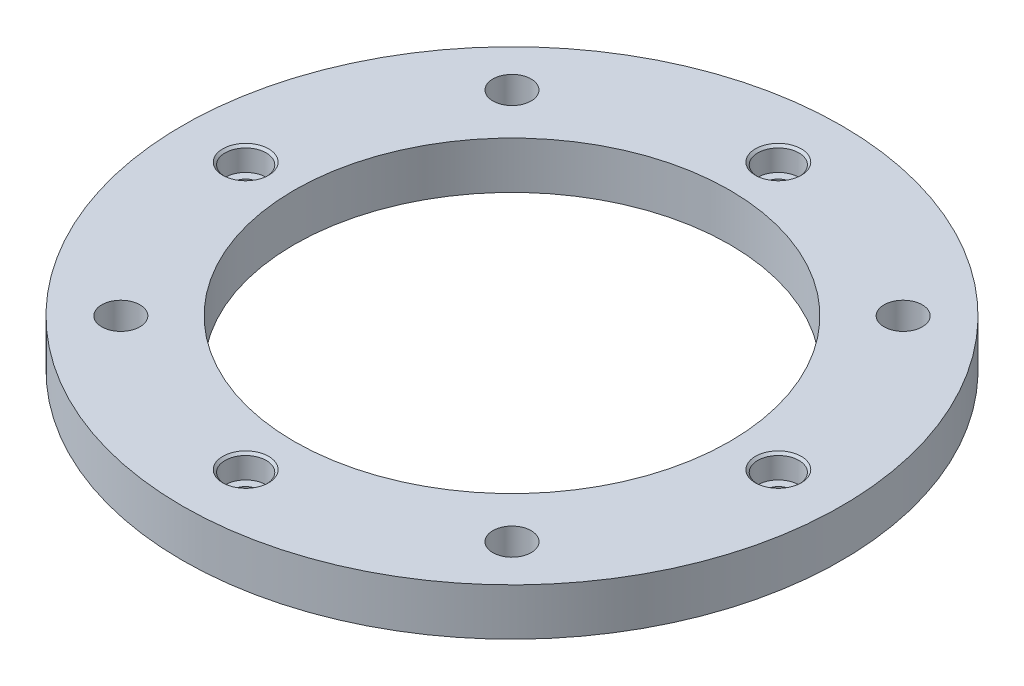
ISO-10303-21;
HEADER;
FILE_DESCRIPTION(('STEP AP214'),'2;1');
FILE_NAME('part.step','',(''),(''),'','','');
FILE_SCHEMA(('AUTOMOTIVE_DESIGN { 1 0 10303 214 1 1 1 1 }'));
ENDSEC;
DATA;
#1=APPLICATION_CONTEXT('core data for automotive mechanical design processes');
#2=APPLICATION_PROTOCOL_DEFINITION('international standard','automotive_design',2000,#1);
#3=PRODUCT_CONTEXT('',#1,'mechanical');
#4=PRODUCT('Part','Part','',(#3));
#5=PRODUCT_RELATED_PRODUCT_CATEGORY('part','',(#4));
#6=PRODUCT_DEFINITION_FORMATION('','',#4);
#7=PRODUCT_DEFINITION_CONTEXT('part definition',#1,'design');
#8=PRODUCT_DEFINITION('design','',#6,#7);
#9=PRODUCT_DEFINITION_SHAPE('','',#8);
#10=(LENGTH_UNIT() NAMED_UNIT(*) SI_UNIT(.MILLI.,.METRE.));
#11=(NAMED_UNIT(*) PLANE_ANGLE_UNIT() SI_UNIT($,.RADIAN.));
#12=(NAMED_UNIT(*) SI_UNIT($,.STERADIAN.) SOLID_ANGLE_UNIT());
#13=UNCERTAINTY_MEASURE_WITH_UNIT(LENGTH_MEASURE(1.E-05),#10,'distance_accuracy_value','');
#14=(GEOMETRIC_REPRESENTATION_CONTEXT(3) GLOBAL_UNCERTAINTY_ASSIGNED_CONTEXT((#13)) GLOBAL_UNIT_ASSIGNED_CONTEXT((#10,
#11,#12)) REPRESENTATION_CONTEXT('',''));
#15=CARTESIAN_POINT('',(0.,0.,0.));
#16=DIRECTION('',(0.,0.,1.));
#17=DIRECTION('',(1.,0.,0.));
#18=AXIS2_PLACEMENT_3D('',#15,#16,#17);
#19=CARTESIAN_POINT('',(0.,12.7,0.));
#20=DIRECTION('',(0.,-1.,0.));
#21=DIRECTION('',(0.,0.,-0.999999999999999));
#22=AXIS2_PLACEMENT_3D('',#19,#20,#21);
#23=PLANE('',#22);
#24=CARTESIAN_POINT('',(0.,12.7,-71.8420489685532));
#25=DIRECTION('',(0.,1.,0.));
#26=DIRECTION('',(0.,0.,0.999999999999999));
#27=AXIS2_PLACEMENT_3D('',#24,#25,#26);
#28=CIRCLE('',#27,6.19125);
#29=CARTESIAN_POINT('',(0.,12.7,-65.6507989685532));
#30=VERTEX_POINT('',#29);
#31=EDGE_CURVE('E152',#30,#30,#28,.T.);
#32=ORIENTED_EDGE('',*,*,#31,.F.);
#33=EDGE_LOOP('',(#32));
#34=FACE_BOUND('',#33,.T.);
#35=CARTESIAN_POINT('',(71.8420489685532,12.7,0.));
#36=DIRECTION('',(0.,1.,0.));
#37=DIRECTION('',(0.,0.,0.999999999999999));
#38=AXIS2_PLACEMENT_3D('',#35,#36,#37);
#39=CIRCLE('',#38,6.19125);
#40=CARTESIAN_POINT('',(71.8420489685532,12.7,6.19125000000007));
#41=VERTEX_POINT('',#40);
#42=EDGE_CURVE('E137',#41,#41,#39,.T.);
#43=ORIENTED_EDGE('',*,*,#42,.F.);
#44=EDGE_LOOP('',(#43));
#45=FACE_BOUND('',#44,.T.);
#46=CARTESIAN_POINT('',(-71.8420489685532,12.7,0.));
#47=DIRECTION('',(0.,1.,0.));
#48=DIRECTION('',(0.,0.,0.999999999999999));
#49=AXIS2_PLACEMENT_3D('',#46,#47,#48);
#50=CIRCLE('',#49,6.19125);
#51=CARTESIAN_POINT('',(-71.8420489685532,12.7,6.19125000000005));
#52=VERTEX_POINT('',#51);
#53=EDGE_CURVE('E122',#52,#52,#50,.T.);
#54=ORIENTED_EDGE('',*,*,#53,.F.);
#55=EDGE_LOOP('',(#54));
#56=FACE_BOUND('',#55,.T.);
#57=CARTESIAN_POINT('',(0.,12.7,71.8420489685532));
#58=DIRECTION('',(0.,1.,0.));
#59=DIRECTION('',(0.,0.,0.999999999999999));
#60=AXIS2_PLACEMENT_3D('',#57,#58,#59);
#61=CIRCLE('',#60,6.19125);
#62=CARTESIAN_POINT('',(0.,12.7,78.0332989685532));
#63=VERTEX_POINT('',#62);
#64=EDGE_CURVE('E107',#63,#63,#61,.T.);
#65=ORIENTED_EDGE('',*,*,#64,.F.);
#66=EDGE_LOOP('',(#65));
#67=FACE_BOUND('',#66,.T.);
#68=CARTESIAN_POINT('',(0.,12.7,0.));
#69=DIRECTION('',(0.,1.,0.));
#70=DIRECTION('',(0.,0.,0.999999999999999));
#71=AXIS2_PLACEMENT_3D('',#68,#69,#70);
#72=CIRCLE('',#71,58.7375);
#73=CARTESIAN_POINT('',(0.,12.7,58.7375));
#74=VERTEX_POINT('',#73);
#75=EDGE_CURVE('E87',#74,#74,#72,.T.);
#76=ORIENTED_EDGE('',*,*,#75,.F.);
#77=EDGE_LOOP('',(#76));
#78=FACE_BOUND('',#77,.T.);
#79=CARTESIAN_POINT('',(-52.7590047112812,12.7,-52.7590047112812));
#80=DIRECTION('',(0.,1.,0.));
#81=DIRECTION('',(0.,0.,0.999999999999999));
#82=AXIS2_PLACEMENT_3D('',#79,#80,#81);
#83=CIRCLE('',#82,5.15937499999999);
#84=CARTESIAN_POINT('',(-52.7590047112812,12.7,-47.5996297112812));
#85=VERTEX_POINT('',#84);
#86=EDGE_CURVE('E83',#85,#85,#83,.T.);
#87=ORIENTED_EDGE('',*,*,#86,.F.);
#88=EDGE_LOOP('',(#87));
#89=FACE_BOUND('',#88,.T.);
#90=CARTESIAN_POINT('',(52.7590047112813,12.7,-52.7590047112812));
#91=DIRECTION('',(0.,1.,0.));
#92=DIRECTION('',(0.,0.,0.999999999999999));
#93=AXIS2_PLACEMENT_3D('',#90,#91,#92);
#94=CIRCLE('',#93,5.15937499999999);
#95=CARTESIAN_POINT('',(52.7590047112813,12.7,-47.5996297112812));
#96=VERTEX_POINT('',#95);
#97=EDGE_CURVE('E75',#96,#96,#94,.T.);
#98=ORIENTED_EDGE('',*,*,#97,.F.);
#99=EDGE_LOOP('',(#98));
#100=FACE_BOUND('',#99,.T.);
#101=CARTESIAN_POINT('',(52.7590047112813,12.7,52.7590047112813));
#102=DIRECTION('',(0.,1.,0.));
#103=DIRECTION('',(0.,0.,0.999999999999999));
#104=AXIS2_PLACEMENT_3D('',#101,#102,#103);
#105=CIRCLE('',#104,5.15937499999999);
#106=CARTESIAN_POINT('',(52.7590047112813,12.7,57.9183797112813));
#107=VERTEX_POINT('',#106);
#108=EDGE_CURVE('E67',#107,#107,#105,.T.);
#109=ORIENTED_EDGE('',*,*,#108,.F.);
#110=EDGE_LOOP('',(#109));
#111=FACE_BOUND('',#110,.T.);
#112=CARTESIAN_POINT('',(-52.7590047112813,12.7,52.7590047112813));
#113=DIRECTION('',(0.,1.,0.));
#114=DIRECTION('',(0.,0.,0.999999999999999));
#115=AXIS2_PLACEMENT_3D('',#112,#113,#114);
#116=CIRCLE('',#115,5.15937499999999);
#117=CARTESIAN_POINT('',(-52.7590047112813,12.7,57.9183797112813));
#118=VERTEX_POINT('',#117);
#119=EDGE_CURVE('E58',#118,#118,#116,.T.);
#120=ORIENTED_EDGE('',*,*,#119,.F.);
#121=EDGE_LOOP('',(#120));
#122=FACE_BOUND('',#121,.T.);
#123=CARTESIAN_POINT('',(0.,12.7,0.));
#124=DIRECTION('',(0.,1.,0.));
#125=DIRECTION('',(0.,0.,0.999999999999999));
#126=AXIS2_PLACEMENT_3D('',#123,#124,#125);
#127=CIRCLE('',#126,88.9);
#128=CARTESIAN_POINT('',(0.,12.7,88.9));
#129=VERTEX_POINT('',#128);
#130=EDGE_CURVE('E90',#129,#129,#127,.T.);
#131=ORIENTED_EDGE('',*,*,#130,.T.);
#132=EDGE_LOOP('',(#131));
#133=FACE_BOUND('',#132,.T.);
#134=ADVANCED_FACE('F47',(#34,#45,#56,#67,#78,#89,#100,#111,#122,#133),#23,.F.);
#135=CARTESIAN_POINT('',(0.,0.,0.));
#136=DIRECTION('',(0.,-1.,0.));
#137=DIRECTION('',(0.,0.,-0.999999999999999));
#138=AXIS2_PLACEMENT_3D('',#135,#136,#137);
#139=PLANE('',#138);
#140=CARTESIAN_POINT('',(0.,0.,-71.8420489685532));
#141=DIRECTION('',(0.,1.,0.));
#142=DIRECTION('',(0.,0.,0.999999999999999));
#143=AXIS2_PLACEMENT_3D('',#140,#141,#142);
#144=CIRCLE('',#143,3.3782);
#145=CARTESIAN_POINT('',(0.,0.,-68.4638489685532));
#146=VERTEX_POINT('',#145);
#147=EDGE_CURVE('E140',#146,#146,#144,.T.);
#148=ORIENTED_EDGE('',*,*,#147,.T.);
#149=EDGE_LOOP('',(#148));
#150=FACE_BOUND('',#149,.T.);
#151=CARTESIAN_POINT('',(71.8420489685532,0.,0.));
#152=DIRECTION('',(0.,1.,0.));
#153=DIRECTION('',(0.,0.,0.999999999999999));
#154=AXIS2_PLACEMENT_3D('',#151,#152,#153);
#155=CIRCLE('',#154,3.3782);
#156=CARTESIAN_POINT('',(71.8420489685532,0.,3.37820000000008));
#157=VERTEX_POINT('',#156);
#158=EDGE_CURVE('E125',#157,#157,#155,.T.);
#159=ORIENTED_EDGE('',*,*,#158,.T.);
#160=EDGE_LOOP('',(#159));
#161=FACE_BOUND('',#160,.T.);
#162=CARTESIAN_POINT('',(-71.8420489685532,0.,0.));
#163=DIRECTION('',(0.,1.,0.));
#164=DIRECTION('',(0.,0.,0.999999999999999));
#165=AXIS2_PLACEMENT_3D('',#162,#163,#164);
#166=CIRCLE('',#165,3.3782);
#167=CARTESIAN_POINT('',(-71.8420489685532,0.,3.37820000000005));
#168=VERTEX_POINT('',#167);
#169=EDGE_CURVE('E110',#168,#168,#166,.T.);
#170=ORIENTED_EDGE('',*,*,#169,.T.);
#171=EDGE_LOOP('',(#170));
#172=FACE_BOUND('',#171,.T.);
#173=CARTESIAN_POINT('',(0.,0.,71.8420489685532));
#174=DIRECTION('',(0.,1.,0.));
#175=DIRECTION('',(0.,0.,0.999999999999999));
#176=AXIS2_PLACEMENT_3D('',#173,#174,#175);
#177=CIRCLE('',#176,3.3782);
#178=CARTESIAN_POINT('',(0.,0.,75.2202489685532));
#179=VERTEX_POINT('',#178);
#180=EDGE_CURVE('E95',#179,#179,#177,.T.);
#181=ORIENTED_EDGE('',*,*,#180,.T.);
#182=EDGE_LOOP('',(#181));
#183=FACE_BOUND('',#182,.T.);
#184=CARTESIAN_POINT('',(0.,0.,0.));
#185=DIRECTION('',(0.,1.,0.));
#186=DIRECTION('',(0.,0.,0.999999999999999));
#187=AXIS2_PLACEMENT_3D('',#184,#185,#186);
#188=CIRCLE('',#187,58.7375);
#189=CARTESIAN_POINT('',(0.,0.,58.7375));
#190=VERTEX_POINT('',#189);
#191=EDGE_CURVE('E86',#190,#190,#188,.T.);
#192=ORIENTED_EDGE('',*,*,#191,.T.);
#193=EDGE_LOOP('',(#192));
#194=FACE_BOUND('',#193,.T.);
#195=CARTESIAN_POINT('',(-52.7590047112812,0.,-52.7590047112812));
#196=DIRECTION('',(0.,-1.,0.));
#197=DIRECTION('',(0.,0.,-0.999999999999999));
#198=AXIS2_PLACEMENT_3D('',#195,#196,#197);
#199=CIRCLE('',#198,5.15937499999999);
#200=CARTESIAN_POINT('',(-52.7590047112812,0.,-57.9183797112812));
#201=VERTEX_POINT('',#200);
#202=EDGE_CURVE('E80',#201,#201,#199,.T.);
#203=ORIENTED_EDGE('',*,*,#202,.F.);
#204=EDGE_LOOP('',(#203));
#205=FACE_BOUND('',#204,.T.);
#206=CARTESIAN_POINT('',(52.7590047112813,0.,-52.7590047112812));
#207=DIRECTION('',(0.,-1.,0.));
#208=DIRECTION('',(0.,0.,-0.999999999999999));
#209=AXIS2_PLACEMENT_3D('',#206,#207,#208);
#210=CIRCLE('',#209,5.15937499999999);
#211=CARTESIAN_POINT('',(52.7590047112813,0.,-57.9183797112812));
#212=VERTEX_POINT('',#211);
#213=EDGE_CURVE('E71',#212,#212,#210,.T.);
#214=ORIENTED_EDGE('',*,*,#213,.F.);
#215=EDGE_LOOP('',(#214));
#216=FACE_BOUND('',#215,.T.);
#217=CARTESIAN_POINT('',(52.7590047112813,0.,52.7590047112813));
#218=DIRECTION('',(0.,-1.,0.));
#219=DIRECTION('',(0.,0.,-0.999999999999999));
#220=AXIS2_PLACEMENT_3D('',#217,#218,#219);
#221=CIRCLE('',#220,5.15937499999999);
#222=CARTESIAN_POINT('',(52.7590047112813,0.,47.5996297112813));
#223=VERTEX_POINT('',#222);
#224=EDGE_CURVE('E63',#223,#223,#221,.T.);
#225=ORIENTED_EDGE('',*,*,#224,.F.);
#226=EDGE_LOOP('',(#225));
#227=FACE_BOUND('',#226,.T.);
#228=CARTESIAN_POINT('',(-52.7590047112813,0.,52.7590047112813));
#229=DIRECTION('',(0.,-1.,0.));
#230=DIRECTION('',(0.,0.,-0.999999999999999));
#231=AXIS2_PLACEMENT_3D('',#228,#229,#230);
#232=CIRCLE('',#231,5.15937499999999);
#233=CARTESIAN_POINT('',(-52.7590047112813,0.,47.5996297112813));
#234=VERTEX_POINT('',#233);
#235=EDGE_CURVE('E54',#234,#234,#232,.T.);
#236=ORIENTED_EDGE('',*,*,#235,.F.);
#237=EDGE_LOOP('',(#236));
#238=FACE_BOUND('',#237,.T.);
#239=CARTESIAN_POINT('',(0.,0.,0.));
#240=DIRECTION('',(0.,-1.,0.));
#241=DIRECTION('',(0.,0.,-0.999999999999999));
#242=AXIS2_PLACEMENT_3D('',#239,#240,#241);
#243=CIRCLE('',#242,88.9);
#244=CARTESIAN_POINT('',(0.,0.,-88.9));
#245=VERTEX_POINT('',#244);
#246=EDGE_CURVE('E13',#245,#245,#243,.T.);
#247=ORIENTED_EDGE('',*,*,#246,.T.);
#248=EDGE_LOOP('',(#247));
#249=FACE_BOUND('',#248,.T.);
#250=ADVANCED_FACE('F49',(#150,#161,#172,#183,#194,#205,#216,#227,#238,#249),#139,.T.);
#251=CARTESIAN_POINT('',(-52.7590047112813,12.7,52.7590047112813));
#252=DIRECTION('',(0.,1.,0.));
#253=DIRECTION('',(0.,0.,0.999999999999999));
#254=AXIS2_PLACEMENT_3D('',#251,#252,#253);
#255=CYLINDRICAL_SURFACE('',#254,5.15937499999999);
#256=ORIENTED_EDGE('',*,*,#235,.T.);
#257=EDGE_LOOP('',(#256));
#258=FACE_BOUND('',#257,.T.);
#259=ORIENTED_EDGE('',*,*,#119,.T.);
#260=EDGE_LOOP('',(#259));
#261=FACE_BOUND('',#260,.T.);
#262=ADVANCED_FACE('F205',(#258,#261),#255,.F.);
#263=CARTESIAN_POINT('',(52.7590047112813,12.7,52.7590047112813));
#264=DIRECTION('',(0.,1.,0.));
#265=DIRECTION('',(0.,0.,0.999999999999999));
#266=AXIS2_PLACEMENT_3D('',#263,#264,#265);
#267=CYLINDRICAL_SURFACE('',#266,5.15937499999999);
#268=ORIENTED_EDGE('',*,*,#224,.T.);
#269=EDGE_LOOP('',(#268));
#270=FACE_BOUND('',#269,.T.);
#271=ORIENTED_EDGE('',*,*,#108,.T.);
#272=EDGE_LOOP('',(#271));
#273=FACE_BOUND('',#272,.T.);
#274=ADVANCED_FACE('F201',(#270,#273),#267,.F.);
#275=CARTESIAN_POINT('',(52.7590047112813,12.7,-52.7590047112812));
#276=DIRECTION('',(0.,1.,0.));
#277=DIRECTION('',(0.,0.,0.999999999999999));
#278=AXIS2_PLACEMENT_3D('',#275,#276,#277);
#279=CYLINDRICAL_SURFACE('',#278,5.15937499999999);
#280=ORIENTED_EDGE('',*,*,#213,.T.);
#281=EDGE_LOOP('',(#280));
#282=FACE_BOUND('',#281,.T.);
#283=ORIENTED_EDGE('',*,*,#97,.T.);
#284=EDGE_LOOP('',(#283));
#285=FACE_BOUND('',#284,.T.);
#286=ADVANCED_FACE('F197',(#282,#285),#279,.F.);
#287=CARTESIAN_POINT('',(-52.7590047112812,12.7,-52.7590047112812));
#288=DIRECTION('',(0.,1.,0.));
#289=DIRECTION('',(0.,0.,0.999999999999999));
#290=AXIS2_PLACEMENT_3D('',#287,#288,#289);
#291=CYLINDRICAL_SURFACE('',#290,5.15937499999999);
#292=ORIENTED_EDGE('',*,*,#202,.T.);
#293=EDGE_LOOP('',(#292));
#294=FACE_BOUND('',#293,.T.);
#295=ORIENTED_EDGE('',*,*,#86,.T.);
#296=EDGE_LOOP('',(#295));
#297=FACE_BOUND('',#296,.T.);
#298=ADVANCED_FACE('F190',(#294,#297),#291,.F.);
#299=CARTESIAN_POINT('',(0.,0.,0.));
#300=DIRECTION('',(0.,1.,0.));
#301=DIRECTION('',(0.,0.,0.999999999999999));
#302=AXIS2_PLACEMENT_3D('',#299,#300,#301);
#303=CYLINDRICAL_SURFACE('',#302,58.7375);
#304=ORIENTED_EDGE('',*,*,#191,.F.);
#305=EDGE_LOOP('',(#304));
#306=FACE_BOUND('',#305,.T.);
#307=ORIENTED_EDGE('',*,*,#75,.T.);
#308=EDGE_LOOP('',(#307));
#309=FACE_BOUND('',#308,.T.);
#310=ADVANCED_FACE('F181',(#306,#309),#303,.F.);
#311=CARTESIAN_POINT('',(0.,0.,0.));
#312=DIRECTION('',(0.,1.,0.));
#313=DIRECTION('',(0.,0.,0.999999999999999));
#314=AXIS2_PLACEMENT_3D('',#311,#312,#313);
#315=CYLINDRICAL_SURFACE('',#314,88.9);
#316=ORIENTED_EDGE('',*,*,#130,.F.);
#317=EDGE_LOOP('',(#316));
#318=FACE_BOUND('',#317,.T.);
#319=ORIENTED_EDGE('',*,*,#246,.F.);
#320=EDGE_LOOP('',(#319));
#321=FACE_BOUND('',#320,.T.);
#322=ADVANCED_FACE('F177',(#318,#321),#315,.T.);
#323=CARTESIAN_POINT('',(0.,12.7,71.8420489685532));
#324=DIRECTION('',(0.,1.,0.));
#325=DIRECTION('',(0.,0.,0.999999999999999));
#326=AXIS2_PLACEMENT_3D('',#323,#324,#325);
#327=CYLINDRICAL_SURFACE('',#326,3.3782);
#328=ORIENTED_EDGE('',*,*,#180,.F.);
#329=EDGE_LOOP('',(#328));
#330=FACE_BOUND('',#329,.T.);
#331=CARTESIAN_POINT('',(0.,6.35000000000001,71.8420489685532));
#332=DIRECTION('',(0.,1.,0.));
#333=DIRECTION('',(0.,0.,0.999999999999999));
#334=AXIS2_PLACEMENT_3D('',#331,#332,#333);
#335=CIRCLE('',#334,3.3782);
#336=CARTESIAN_POINT('',(0.,6.35000000000001,75.2202489685532));
#337=VERTEX_POINT('',#336);
#338=EDGE_CURVE('E98',#337,#337,#335,.T.);
#339=ORIENTED_EDGE('',*,*,#338,.T.);
#340=EDGE_LOOP('',(#339));
#341=FACE_BOUND('',#340,.T.);
#342=ADVANCED_FACE('F180',(#330,#341),#327,.F.);
#343=CARTESIAN_POINT('',(5.55625,6.35,71.8420489685532));
#344=DIRECTION('',(0.,-1.,0.));
#345=DIRECTION('',(0.,0.,-0.999999999999999));
#346=AXIS2_PLACEMENT_3D('',#343,#344,#345);
#347=PLANE('',#346);
#348=ORIENTED_EDGE('',*,*,#338,.F.);
#349=EDGE_LOOP('',(#348));
#350=FACE_BOUND('',#349,.T.);
#351=CARTESIAN_POINT('',(0.,6.35000000000001,71.8420489685532));
#352=DIRECTION('',(0.,1.,0.));
#353=DIRECTION('',(0.,0.,0.999999999999999));
#354=AXIS2_PLACEMENT_3D('',#351,#352,#353);
#355=CIRCLE('',#354,5.55625);
#356=CARTESIAN_POINT('',(0.,6.35000000000001,77.3982989685532));
#357=VERTEX_POINT('',#356);
#358=EDGE_CURVE('E101',#357,#357,#355,.T.);
#359=ORIENTED_EDGE('',*,*,#358,.T.);
#360=EDGE_LOOP('',(#359));
#361=FACE_BOUND('',#360,.T.);
#362=ADVANCED_FACE('F187',(#350,#361),#347,.F.);
#363=CARTESIAN_POINT('',(0.,12.7,71.8420489685532));
#364=DIRECTION('',(0.,1.,0.));
#365=DIRECTION('',(0.,0.,0.999999999999999));
#366=AXIS2_PLACEMENT_3D('',#363,#364,#365);
#367=CYLINDRICAL_SURFACE('',#366,5.55625);
#368=ORIENTED_EDGE('',*,*,#358,.F.);
#369=EDGE_LOOP('',(#368));
#370=FACE_BOUND('',#369,.T.);
#371=CARTESIAN_POINT('',(0.,12.065,71.8420489685532));
#372=DIRECTION('',(0.,1.,0.));
#373=DIRECTION('',(0.,0.,0.999999999999999));
#374=AXIS2_PLACEMENT_3D('',#371,#372,#373);
#375=CIRCLE('',#374,5.55625);
#376=CARTESIAN_POINT('',(0.,12.065,77.3982989685532));
#377=VERTEX_POINT('',#376);
#378=EDGE_CURVE('E104',#377,#377,#375,.T.);
#379=ORIENTED_EDGE('',*,*,#378,.T.);
#380=EDGE_LOOP('',(#379));
#381=FACE_BOUND('',#380,.T.);
#382=ADVANCED_FACE('F237',(#370,#381),#367,.F.);
#383=CARTESIAN_POINT('',(0.,12.7,71.8420489685532));
#384=DIRECTION('',(0.,1.,0.));
#385=DIRECTION('',(0.,0.,0.999999999999999));
#386=AXIS2_PLACEMENT_3D('',#383,#384,#385);
#387=CONICAL_SURFACE('',#386,6.19125,0.785398163397448);
#388=ORIENTED_EDGE('',*,*,#378,.F.);
#389=EDGE_LOOP('',(#388));
#390=FACE_BOUND('',#389,.T.);
#391=ORIENTED_EDGE('',*,*,#64,.T.);
#392=EDGE_LOOP('',(#391));
#393=FACE_BOUND('',#392,.T.);
#394=ADVANCED_FACE('F242',(#390,#393),#387,.F.);
#395=CARTESIAN_POINT('',(-71.8420489685532,12.7,0.));
#396=DIRECTION('',(0.,1.,0.));
#397=DIRECTION('',(0.,0.,0.999999999999999));
#398=AXIS2_PLACEMENT_3D('',#395,#396,#397);
#399=CYLINDRICAL_SURFACE('',#398,3.3782);
#400=ORIENTED_EDGE('',*,*,#169,.F.);
#401=EDGE_LOOP('',(#400));
#402=FACE_BOUND('',#401,.T.);
#403=CARTESIAN_POINT('',(-71.8420489685532,6.35000000000001,0.));
#404=DIRECTION('',(0.,1.,0.));
#405=DIRECTION('',(0.,0.,0.999999999999999));
#406=AXIS2_PLACEMENT_3D('',#403,#404,#405);
#407=CIRCLE('',#406,3.3782);
#408=CARTESIAN_POINT('',(-71.8420489685532,6.35000000000001,3.37820000000005));
#409=VERTEX_POINT('',#408);
#410=EDGE_CURVE('E113',#409,#409,#407,.T.);
#411=ORIENTED_EDGE('',*,*,#410,.T.);
#412=EDGE_LOOP('',(#411));
#413=FACE_BOUND('',#412,.T.);
#414=ADVANCED_FACE('F248',(#402,#413),#399,.F.);
#415=CARTESIAN_POINT('',(-66.2857989685532,6.35000000000001,0.));
#416=DIRECTION('',(0.,-1.,0.));
#417=DIRECTION('',(0.,0.,-0.999999999999999));
#418=AXIS2_PLACEMENT_3D('',#415,#416,#417);
#419=PLANE('',#418);
#420=ORIENTED_EDGE('',*,*,#410,.F.);
#421=EDGE_LOOP('',(#420));
#422=FACE_BOUND('',#421,.T.);
#423=CARTESIAN_POINT('',(-71.8420489685532,6.35000000000001,0.));
#424=DIRECTION('',(0.,1.,0.));
#425=DIRECTION('',(0.,0.,0.999999999999999));
#426=AXIS2_PLACEMENT_3D('',#423,#424,#425);
#427=CIRCLE('',#426,5.55625);
#428=CARTESIAN_POINT('',(-71.8420489685532,6.35000000000001,5.55625000000005));
#429=VERTEX_POINT('',#428);
#430=EDGE_CURVE('E116',#429,#429,#427,.T.);
#431=ORIENTED_EDGE('',*,*,#430,.T.);
#432=EDGE_LOOP('',(#431));
#433=FACE_BOUND('',#432,.T.);
#434=ADVANCED_FACE('F253',(#422,#433),#419,.F.);
#435=CARTESIAN_POINT('',(-71.8420489685532,12.7,0.));
#436=DIRECTION('',(0.,1.,0.));
#437=DIRECTION('',(0.,0.,0.999999999999999));
#438=AXIS2_PLACEMENT_3D('',#435,#436,#437);
#439=CYLINDRICAL_SURFACE('',#438,5.55625);
#440=ORIENTED_EDGE('',*,*,#430,.F.);
#441=EDGE_LOOP('',(#440));
#442=FACE_BOUND('',#441,.T.);
#443=CARTESIAN_POINT('',(-71.8420489685532,12.065,0.));
#444=DIRECTION('',(0.,1.,0.));
#445=DIRECTION('',(0.,0.,0.999999999999999));
#446=AXIS2_PLACEMENT_3D('',#443,#444,#445);
#447=CIRCLE('',#446,5.55625);
#448=CARTESIAN_POINT('',(-71.8420489685532,12.065,5.55625000000005));
#449=VERTEX_POINT('',#448);
#450=EDGE_CURVE('E119',#449,#449,#447,.T.);
#451=ORIENTED_EDGE('',*,*,#450,.T.);
#452=EDGE_LOOP('',(#451));
#453=FACE_BOUND('',#452,.T.);
#454=ADVANCED_FACE('F259',(#442,#453),#439,.F.);
#455=CARTESIAN_POINT('',(-71.8420489685532,12.7,0.));
#456=DIRECTION('',(0.,1.,0.));
#457=DIRECTION('',(0.,0.,0.999999999999999));
#458=AXIS2_PLACEMENT_3D('',#455,#456,#457);
#459=CONICAL_SURFACE('',#458,6.19125,0.785398163397446);
#460=ORIENTED_EDGE('',*,*,#450,.F.);
#461=EDGE_LOOP('',(#460));
#462=FACE_BOUND('',#461,.T.);
#463=ORIENTED_EDGE('',*,*,#53,.T.);
#464=EDGE_LOOP('',(#463));
#465=FACE_BOUND('',#464,.T.);
#466=ADVANCED_FACE('F263',(#462,#465),#459,.F.);
#467=CARTESIAN_POINT('',(71.8420489685532,12.7,0.));
#468=DIRECTION('',(0.,1.,0.));
#469=DIRECTION('',(0.,0.,0.999999999999999));
#470=AXIS2_PLACEMENT_3D('',#467,#468,#469);
#471=CYLINDRICAL_SURFACE('',#470,3.3782);
#472=ORIENTED_EDGE('',*,*,#158,.F.);
#473=EDGE_LOOP('',(#472));
#474=FACE_BOUND('',#473,.T.);
#475=CARTESIAN_POINT('',(71.8420489685532,6.35,0.));
#476=DIRECTION('',(0.,1.,0.));
#477=DIRECTION('',(0.,0.,0.999999999999999));
#478=AXIS2_PLACEMENT_3D('',#475,#476,#477);
#479=CIRCLE('',#478,3.3782);
#480=CARTESIAN_POINT('',(71.8420489685532,6.35,3.37820000000008));
#481=VERTEX_POINT('',#480);
#482=EDGE_CURVE('E128',#481,#481,#479,.T.);
#483=ORIENTED_EDGE('',*,*,#482,.T.);
#484=EDGE_LOOP('',(#483));
#485=FACE_BOUND('',#484,.T.);
#486=ADVANCED_FACE('F267',(#474,#485),#471,.F.);
#487=CARTESIAN_POINT('',(77.3982989685532,6.34999999999999,0.));
#488=DIRECTION('',(0.,-1.,0.));
#489=DIRECTION('',(0.,0.,-0.999999999999999));
#490=AXIS2_PLACEMENT_3D('',#487,#488,#489);
#491=PLANE('',#490);
#492=ORIENTED_EDGE('',*,*,#482,.F.);
#493=EDGE_LOOP('',(#492));
#494=FACE_BOUND('',#493,.T.);
#495=CARTESIAN_POINT('',(71.8420489685532,6.35,0.));
#496=DIRECTION('',(0.,1.,0.));
#497=DIRECTION('',(0.,0.,0.999999999999999));
#498=AXIS2_PLACEMENT_3D('',#495,#496,#497);
#499=CIRCLE('',#498,5.55625);
#500=CARTESIAN_POINT('',(71.8420489685532,6.35,5.55625000000008));
#501=VERTEX_POINT('',#500);
#502=EDGE_CURVE('E131',#501,#501,#499,.T.);
#503=ORIENTED_EDGE('',*,*,#502,.T.);
#504=EDGE_LOOP('',(#503));
#505=FACE_BOUND('',#504,.T.);
#506=ADVANCED_FACE('F271',(#494,#505),#491,.F.);
#507=CARTESIAN_POINT('',(71.8420489685532,12.7,0.));
#508=DIRECTION('',(0.,1.,0.));
#509=DIRECTION('',(0.,0.,0.999999999999999));
#510=AXIS2_PLACEMENT_3D('',#507,#508,#509);
#511=CYLINDRICAL_SURFACE('',#510,5.55625);
#512=ORIENTED_EDGE('',*,*,#502,.F.);
#513=EDGE_LOOP('',(#512));
#514=FACE_BOUND('',#513,.T.);
#515=CARTESIAN_POINT('',(71.8420489685532,12.065,0.));
#516=DIRECTION('',(0.,1.,0.));
#517=DIRECTION('',(0.,0.,0.999999999999999));
#518=AXIS2_PLACEMENT_3D('',#515,#516,#517);
#519=CIRCLE('',#518,5.55625);
#520=CARTESIAN_POINT('',(71.8420489685532,12.065,5.55625000000008));
#521=VERTEX_POINT('',#520);
#522=EDGE_CURVE('E134',#521,#521,#519,.T.);
#523=ORIENTED_EDGE('',*,*,#522,.T.);
#524=EDGE_LOOP('',(#523));
#525=FACE_BOUND('',#524,.T.);
#526=ADVANCED_FACE('F275',(#514,#525),#511,.F.);
#527=CARTESIAN_POINT('',(71.8420489685532,12.7,0.));
#528=DIRECTION('',(0.,1.,0.));
#529=DIRECTION('',(0.,0.,0.999999999999999));
#530=AXIS2_PLACEMENT_3D('',#527,#528,#529);
#531=CONICAL_SURFACE('',#530,6.19125,0.785398163397446);
#532=ORIENTED_EDGE('',*,*,#522,.F.);
#533=EDGE_LOOP('',(#532));
#534=FACE_BOUND('',#533,.T.);
#535=ORIENTED_EDGE('',*,*,#42,.T.);
#536=EDGE_LOOP('',(#535));
#537=FACE_BOUND('',#536,.T.);
#538=ADVANCED_FACE('F279',(#534,#537),#531,.F.);
#539=CARTESIAN_POINT('',(0.,12.7,-71.8420489685532));
#540=DIRECTION('',(0.,1.,0.));
#541=DIRECTION('',(0.,0.,0.999999999999999));
#542=AXIS2_PLACEMENT_3D('',#539,#540,#541);
#543=CYLINDRICAL_SURFACE('',#542,3.3782);
#544=ORIENTED_EDGE('',*,*,#147,.F.);
#545=EDGE_LOOP('',(#544));
#546=FACE_BOUND('',#545,.T.);
#547=CARTESIAN_POINT('',(0.,6.35,-71.8420489685532));
#548=DIRECTION('',(0.,1.,0.));
#549=DIRECTION('',(0.,0.,0.999999999999999));
#550=AXIS2_PLACEMENT_3D('',#547,#548,#549);
#551=CIRCLE('',#550,3.3782);
#552=CARTESIAN_POINT('',(0.,6.35,-68.4638489685532));
#553=VERTEX_POINT('',#552);
#554=EDGE_CURVE('E143',#553,#553,#551,.T.);
#555=ORIENTED_EDGE('',*,*,#554,.T.);
#556=EDGE_LOOP('',(#555));
#557=FACE_BOUND('',#556,.T.);
#558=ADVANCED_FACE('F283',(#546,#557),#543,.F.);
#559=CARTESIAN_POINT('',(5.55625,6.35,-71.8420489685532));
#560=DIRECTION('',(0.,-1.,0.));
#561=DIRECTION('',(0.,0.,-0.999999999999999));
#562=AXIS2_PLACEMENT_3D('',#559,#560,#561);
#563=PLANE('',#562);
#564=ORIENTED_EDGE('',*,*,#554,.F.);
#565=EDGE_LOOP('',(#564));
#566=FACE_BOUND('',#565,.T.);
#567=CARTESIAN_POINT('',(0.,6.35,-71.8420489685532));
#568=DIRECTION('',(0.,1.,0.));
#569=DIRECTION('',(0.,0.,0.999999999999999));
#570=AXIS2_PLACEMENT_3D('',#567,#568,#569);
#571=CIRCLE('',#570,5.55625);
#572=CARTESIAN_POINT('',(0.,6.35,-66.2857989685532));
#573=VERTEX_POINT('',#572);
#574=EDGE_CURVE('E146',#573,#573,#571,.T.);
#575=ORIENTED_EDGE('',*,*,#574,.T.);
#576=EDGE_LOOP('',(#575));
#577=FACE_BOUND('',#576,.T.);
#578=ADVANCED_FACE('F287',(#566,#577),#563,.F.);
#579=CARTESIAN_POINT('',(0.,12.7,-71.8420489685532));
#580=DIRECTION('',(0.,1.,0.));
#581=DIRECTION('',(0.,0.,0.999999999999999));
#582=AXIS2_PLACEMENT_3D('',#579,#580,#581);
#583=CYLINDRICAL_SURFACE('',#582,5.55625);
#584=ORIENTED_EDGE('',*,*,#574,.F.);
#585=EDGE_LOOP('',(#584));
#586=FACE_BOUND('',#585,.T.);
#587=CARTESIAN_POINT('',(0.,12.065,-71.8420489685532));
#588=DIRECTION('',(0.,1.,0.));
#589=DIRECTION('',(0.,0.,0.999999999999999));
#590=AXIS2_PLACEMENT_3D('',#587,#588,#589);
#591=CIRCLE('',#590,5.55625);
#592=CARTESIAN_POINT('',(0.,12.065,-66.2857989685532));
#593=VERTEX_POINT('',#592);
#594=EDGE_CURVE('E149',#593,#593,#591,.T.);
#595=ORIENTED_EDGE('',*,*,#594,.T.);
#596=EDGE_LOOP('',(#595));
#597=FACE_BOUND('',#596,.T.);
#598=ADVANCED_FACE('F291',(#586,#597),#583,.F.);
#599=CARTESIAN_POINT('',(0.,12.7,-71.8420489685532));
#600=DIRECTION('',(0.,1.,0.));
#601=DIRECTION('',(0.,0.,0.999999999999999));
#602=AXIS2_PLACEMENT_3D('',#599,#600,#601);
#603=CONICAL_SURFACE('',#602,6.19125,0.785398163397448);
#604=ORIENTED_EDGE('',*,*,#594,.F.);
#605=EDGE_LOOP('',(#604));
#606=FACE_BOUND('',#605,.T.);
#607=ORIENTED_EDGE('',*,*,#31,.T.);
#608=EDGE_LOOP('',(#607));
#609=FACE_BOUND('',#608,.T.);
#610=ADVANCED_FACE('F156',(#606,#609),#603,.F.);
#611=CLOSED_SHELL('',(#134,#250,#262,#274,#286,#298,#310,#322,#342,#362,#382,#394,#414,#434,
#454,#466,#486,#506,#526,#538,#558,#578,#598,#610));
#612=MANIFOLD_SOLID_BREP('B2',#611);
#613=ADVANCED_BREP_SHAPE_REPRESENTATION('',(#18,#612),#14);
#614=SHAPE_DEFINITION_REPRESENTATION(#9,#613);
ENDSEC;
END-ISO-10303-21;
